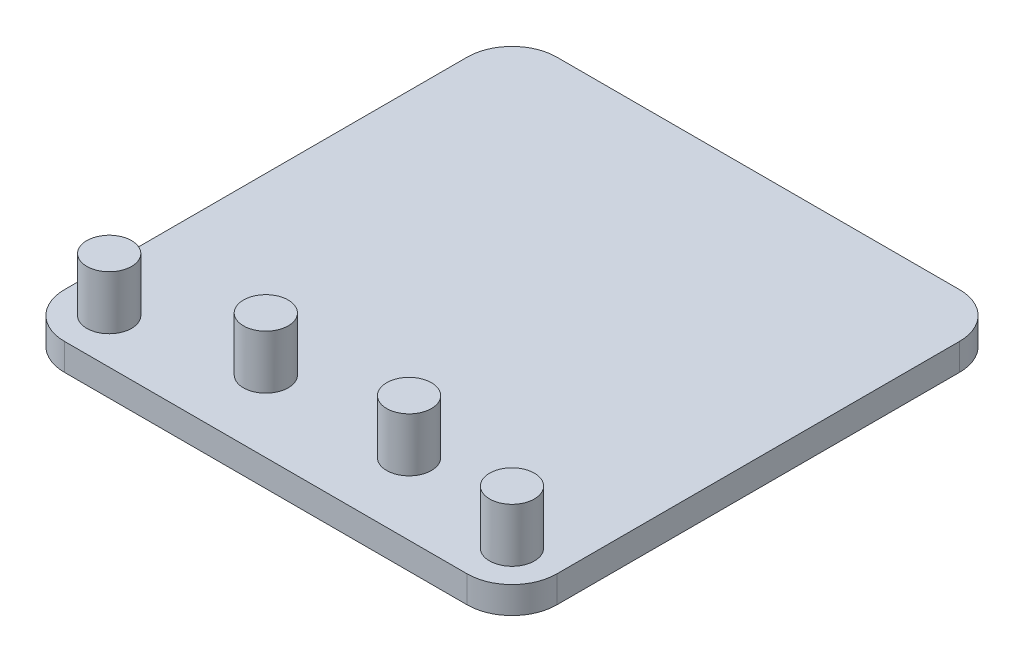
ISO-10303-21;
HEADER;
FILE_DESCRIPTION(('STEP AP214'),'2;1');
FILE_NAME('part.step','',(''),(''),'','','');
FILE_SCHEMA(('AUTOMOTIVE_DESIGN { 1 0 10303 214 1 1 1 1 }'));
ENDSEC;
DATA;
#1=APPLICATION_CONTEXT('core data for automotive mechanical design processes');
#2=APPLICATION_PROTOCOL_DEFINITION('international standard','automotive_design',2000,#1);
#3=PRODUCT_CONTEXT('',#1,'mechanical');
#4=PRODUCT('Part','Part','',(#3));
#5=PRODUCT_RELATED_PRODUCT_CATEGORY('part','',(#4));
#6=PRODUCT_DEFINITION_FORMATION('','',#4);
#7=PRODUCT_DEFINITION_CONTEXT('part definition',#1,'design');
#8=PRODUCT_DEFINITION('design','',#6,#7);
#9=PRODUCT_DEFINITION_SHAPE('','',#8);
#10=(LENGTH_UNIT() NAMED_UNIT(*) SI_UNIT(.MILLI.,.METRE.));
#11=(NAMED_UNIT(*) PLANE_ANGLE_UNIT() SI_UNIT($,.RADIAN.));
#12=(NAMED_UNIT(*) SI_UNIT($,.STERADIAN.) SOLID_ANGLE_UNIT());
#13=UNCERTAINTY_MEASURE_WITH_UNIT(LENGTH_MEASURE(1.E-05),#10,'distance_accuracy_value','');
#14=(GEOMETRIC_REPRESENTATION_CONTEXT(3) GLOBAL_UNCERTAINTY_ASSIGNED_CONTEXT((#13)) GLOBAL_UNIT_ASSIGNED_CONTEXT((#10,
#11,#12)) REPRESENTATION_CONTEXT('',''));
#15=CARTESIAN_POINT('',(0.,0.,0.));
#16=DIRECTION('',(0.,0.,1.));
#17=DIRECTION('',(1.,0.,0.));
#18=AXIS2_PLACEMENT_3D('',#15,#16,#17);
#19=CARTESIAN_POINT('',(0.,6.,0.));
#20=DIRECTION('',(1.,0.,0.));
#21=DIRECTION('',(0.,0.,-1.));
#22=AXIS2_PLACEMENT_3D('',#19,#20,#21);
#23=PLANE('',#22);
#24=DIRECTION('',(0.,0.,1.));
#25=VECTOR('',#24,1.);
#26=CARTESIAN_POINT('',(0.,6.,0.));
#27=LINE('',#26,#25);
#28=CARTESIAN_POINT('',(0.,6.,-100.));
#29=VERTEX_POINT('',#28);
#30=CARTESIAN_POINT('',(0.,6.,-10.));
#31=VERTEX_POINT('',#30);
#32=EDGE_CURVE('E123',#29,#31,#27,.T.);
#33=ORIENTED_EDGE('',*,*,#32,.F.);
#34=DIRECTION('',(0.,-1.,0.));
#35=VECTOR('',#34,1.);
#36=CARTESIAN_POINT('',(0.,6.,-100.));
#37=LINE('',#36,#35);
#38=CARTESIAN_POINT('',(0.,0.,-100.));
#39=VERTEX_POINT('',#38);
#40=EDGE_CURVE('E108',#29,#39,#37,.T.);
#41=ORIENTED_EDGE('',*,*,#40,.T.);
#42=DIRECTION('',(0.,0.,1.));
#43=VECTOR('',#42,1.);
#44=CARTESIAN_POINT('',(0.,0.,0.));
#45=LINE('',#44,#43);
#46=CARTESIAN_POINT('',(0.,0.,-10.));
#47=VERTEX_POINT('',#46);
#48=EDGE_CURVE('E120',#39,#47,#45,.T.);
#49=ORIENTED_EDGE('',*,*,#48,.T.);
#50=DIRECTION('',(0.,-1.,0.));
#51=VECTOR('',#50,1.);
#52=CARTESIAN_POINT('',(0.,6.,-10.));
#53=LINE('',#52,#51);
#54=EDGE_CURVE('E125',#47,#31,#53,.F.);
#55=ORIENTED_EDGE('',*,*,#54,.T.);
#56=EDGE_LOOP('',(#33,#41,#49,#55));
#57=FACE_BOUND('',#56,.T.);
#58=ADVANCED_FACE('F37',(#57),#23,.F.);
#59=CARTESIAN_POINT('',(0.,6.,0.));
#60=DIRECTION('',(0.,0.,-1.));
#61=DIRECTION('',(-1.,0.,0.));
#62=AXIS2_PLACEMENT_3D('',#59,#60,#61);
#63=PLANE('',#62);
#64=DIRECTION('',(1.,0.,0.));
#65=VECTOR('',#64,1.);
#66=CARTESIAN_POINT('',(0.,0.,0.));
#67=LINE('',#66,#65);
#68=CARTESIAN_POINT('',(10.,0.,0.));
#69=VERTEX_POINT('',#68);
#70=CARTESIAN_POINT('',(100.,0.,0.));
#71=VERTEX_POINT('',#70);
#72=EDGE_CURVE('E129',#69,#71,#67,.T.);
#73=ORIENTED_EDGE('',*,*,#72,.T.);
#74=DIRECTION('',(0.,-1.,0.));
#75=VECTOR('',#74,1.);
#76=CARTESIAN_POINT('',(100.,6.,0.));
#77=LINE('',#76,#75);
#78=CARTESIAN_POINT('',(100.,6.,0.));
#79=VERTEX_POINT('',#78);
#80=EDGE_CURVE('E167',#71,#79,#77,.F.);
#81=ORIENTED_EDGE('',*,*,#80,.T.);
#82=DIRECTION('',(1.,0.,0.));
#83=VECTOR('',#82,1.);
#84=CARTESIAN_POINT('',(0.,6.,0.));
#85=LINE('',#84,#83);
#86=CARTESIAN_POINT('',(10.,6.,0.));
#87=VERTEX_POINT('',#86);
#88=EDGE_CURVE('E194',#87,#79,#85,.T.);
#89=ORIENTED_EDGE('',*,*,#88,.F.);
#90=DIRECTION('',(0.,-1.,0.));
#91=VECTOR('',#90,1.);
#92=CARTESIAN_POINT('',(10.,6.,0.));
#93=LINE('',#92,#91);
#94=EDGE_CURVE('E164',#87,#69,#93,.T.);
#95=ORIENTED_EDGE('',*,*,#94,.T.);
#96=EDGE_LOOP('',(#73,#81,#89,#95));
#97=FACE_BOUND('',#96,.T.);
#98=ADVANCED_FACE('F223',(#97),#63,.F.);
#99=CARTESIAN_POINT('',(110.,6.,0.));
#100=DIRECTION('',(-1.,0.,0.));
#101=DIRECTION('',(0.,0.,1.));
#102=AXIS2_PLACEMENT_3D('',#99,#100,#101);
#103=PLANE('',#102);
#104=DIRECTION('',(0.,0.,-1.));
#105=VECTOR('',#104,1.);
#106=CARTESIAN_POINT('',(110.,0.,0.));
#107=LINE('',#106,#105);
#108=CARTESIAN_POINT('',(110.,0.,-10.));
#109=VERTEX_POINT('',#108);
#110=CARTESIAN_POINT('',(110.,0.,-100.));
#111=VERTEX_POINT('',#110);
#112=EDGE_CURVE('E133',#109,#111,#107,.T.);
#113=ORIENTED_EDGE('',*,*,#112,.T.);
#114=DIRECTION('',(0.,-1.,0.));
#115=VECTOR('',#114,1.);
#116=CARTESIAN_POINT('',(110.,6.,-100.));
#117=LINE('',#116,#115);
#118=CARTESIAN_POINT('',(110.,6.,-100.));
#119=VERTEX_POINT('',#118);
#120=EDGE_CURVE('E52',#111,#119,#117,.F.);
#121=ORIENTED_EDGE('',*,*,#120,.T.);
#122=DIRECTION('',(0.,0.,-1.));
#123=VECTOR('',#122,1.);
#124=CARTESIAN_POINT('',(110.,6.,0.));
#125=LINE('',#124,#123);
#126=CARTESIAN_POINT('',(110.,6.,-10.));
#127=VERTEX_POINT('',#126);
#128=EDGE_CURVE('E193',#127,#119,#125,.T.);
#129=ORIENTED_EDGE('',*,*,#128,.F.);
#130=DIRECTION('',(0.,-1.,0.));
#131=VECTOR('',#130,1.);
#132=CARTESIAN_POINT('',(110.,6.,-10.));
#133=LINE('',#132,#131);
#134=EDGE_CURVE('E160',#127,#109,#133,.T.);
#135=ORIENTED_EDGE('',*,*,#134,.T.);
#136=EDGE_LOOP('',(#113,#121,#129,#135));
#137=FACE_BOUND('',#136,.T.);
#138=ADVANCED_FACE('F228',(#137),#103,.F.);
#139=CARTESIAN_POINT('',(0.,6.,-110.));
#140=DIRECTION('',(0.,0.,1.));
#141=DIRECTION('',(1.,0.,0.));
#142=AXIS2_PLACEMENT_3D('',#139,#140,#141);
#143=PLANE('',#142);
#144=DIRECTION('',(-1.,0.,0.));
#145=VECTOR('',#144,1.);
#146=CARTESIAN_POINT('',(0.,0.,-110.));
#147=LINE('',#146,#145);
#148=CARTESIAN_POINT('',(100.,0.,-110.));
#149=VERTEX_POINT('',#148);
#150=CARTESIAN_POINT('',(10.,0.,-110.));
#151=VERTEX_POINT('',#150);
#152=EDGE_CURVE('E143',#149,#151,#147,.T.);
#153=ORIENTED_EDGE('',*,*,#152,.T.);
#154=DIRECTION('',(0.,-1.,0.));
#155=VECTOR('',#154,1.);
#156=CARTESIAN_POINT('',(10.,6.,-110.));
#157=LINE('',#156,#155);
#158=CARTESIAN_POINT('',(10.,6.,-110.));
#159=VERTEX_POINT('',#158);
#160=EDGE_CURVE('E109',#151,#159,#157,.F.);
#161=ORIENTED_EDGE('',*,*,#160,.T.);
#162=DIRECTION('',(-1.,0.,0.));
#163=VECTOR('',#162,1.);
#164=CARTESIAN_POINT('',(0.,6.,-110.));
#165=LINE('',#164,#163);
#166=CARTESIAN_POINT('',(100.,6.,-110.));
#167=VERTEX_POINT('',#166);
#168=EDGE_CURVE('E139',#167,#159,#165,.T.);
#169=ORIENTED_EDGE('',*,*,#168,.F.);
#170=DIRECTION('',(0.,-1.,0.));
#171=VECTOR('',#170,1.);
#172=CARTESIAN_POINT('',(100.,6.,-110.));
#173=LINE('',#172,#171);
#174=EDGE_CURVE('E114',#167,#149,#173,.T.);
#175=ORIENTED_EDGE('',*,*,#174,.T.);
#176=EDGE_LOOP('',(#153,#161,#169,#175));
#177=FACE_BOUND('',#176,.T.);
#178=ADVANCED_FACE('F182',(#177),#143,.F.);
#179=CARTESIAN_POINT('',(0.,6.,0.));
#180=DIRECTION('',(0.,-1.,0.));
#181=DIRECTION('',(0.,0.,-1.));
#182=AXIS2_PLACEMENT_3D('',#179,#180,#181);
#183=PLANE('',#182);
#184=CARTESIAN_POINT('',(100.,6.,-10.));
#185=DIRECTION('',(0.,-1.,0.));
#186=DIRECTION('',(0.,0.,-1.));
#187=AXIS2_PLACEMENT_3D('',#184,#185,#186);
#188=CIRCLE('',#187,5.);
#189=CARTESIAN_POINT('',(100.,6.,-15.));
#190=VERTEX_POINT('',#189);
#191=EDGE_CURVE('E11',#190,#190,#188,.F.);
#192=ORIENTED_EDGE('',*,*,#191,.F.);
#193=EDGE_LOOP('',(#192));
#194=FACE_BOUND('',#193,.T.);
#195=CARTESIAN_POINT('',(10.,6.,-9.99999999999999));
#196=DIRECTION('',(0.,-1.,0.));
#197=DIRECTION('',(0.,0.,-1.));
#198=AXIS2_PLACEMENT_3D('',#195,#196,#197);
#199=CIRCLE('',#198,5.);
#200=CARTESIAN_POINT('',(10.,6.,-15.));
#201=VERTEX_POINT('',#200);
#202=EDGE_CURVE('E45',#201,#201,#199,.F.);
#203=ORIENTED_EDGE('',*,*,#202,.F.);
#204=EDGE_LOOP('',(#203));
#205=FACE_BOUND('',#204,.T.);
#206=CARTESIAN_POINT('',(71.,6.,-16.));
#207=DIRECTION('',(0.,-1.,0.));
#208=DIRECTION('',(0.,0.,-1.));
#209=AXIS2_PLACEMENT_3D('',#206,#207,#208);
#210=CIRCLE('',#209,5.);
#211=CARTESIAN_POINT('',(71.,6.,-21.));
#212=VERTEX_POINT('',#211);
#213=EDGE_CURVE('E172',#212,#212,#210,.F.);
#214=ORIENTED_EDGE('',*,*,#213,.F.);
#215=EDGE_LOOP('',(#214));
#216=FACE_BOUND('',#215,.T.);
#217=CARTESIAN_POINT('',(39.,6.,-16.));
#218=DIRECTION('',(0.,-1.,0.));
#219=DIRECTION('',(0.,0.,-1.));
#220=AXIS2_PLACEMENT_3D('',#217,#218,#219);
#221=CIRCLE('',#220,5.);
#222=CARTESIAN_POINT('',(39.,6.,-21.));
#223=VERTEX_POINT('',#222);
#224=EDGE_CURVE('E169',#223,#223,#221,.F.);
#225=ORIENTED_EDGE('',*,*,#224,.F.);
#226=EDGE_LOOP('',(#225));
#227=FACE_BOUND('',#226,.T.);
#228=ORIENTED_EDGE('',*,*,#168,.T.);
#229=CARTESIAN_POINT('',(10.,6.,-100.));
#230=DIRECTION('',(0.,-1.,0.));
#231=DIRECTION('',(0.,0.,-1.));
#232=AXIS2_PLACEMENT_3D('',#229,#230,#231);
#233=CIRCLE('',#232,10.);
#234=EDGE_CURVE('E158',#159,#29,#233,.F.);
#235=ORIENTED_EDGE('',*,*,#234,.T.);
#236=ORIENTED_EDGE('',*,*,#32,.T.);
#237=CARTESIAN_POINT('',(10.,6.,-10.));
#238=DIRECTION('',(0.,-1.,0.));
#239=DIRECTION('',(0.,0.,-1.));
#240=AXIS2_PLACEMENT_3D('',#237,#238,#239);
#241=CIRCLE('',#240,10.);
#242=EDGE_CURVE('E153',#31,#87,#241,.F.);
#243=ORIENTED_EDGE('',*,*,#242,.T.);
#244=ORIENTED_EDGE('',*,*,#88,.T.);
#245=CARTESIAN_POINT('',(100.,6.,-10.));
#246=DIRECTION('',(0.,-1.,0.));
#247=DIRECTION('',(0.,0.,-1.));
#248=AXIS2_PLACEMENT_3D('',#245,#246,#247);
#249=CIRCLE('',#248,10.);
#250=EDGE_CURVE('E59',#79,#127,#249,.F.);
#251=ORIENTED_EDGE('',*,*,#250,.T.);
#252=ORIENTED_EDGE('',*,*,#128,.T.);
#253=CARTESIAN_POINT('',(100.,6.,-100.));
#254=DIRECTION('',(0.,-1.,0.));
#255=DIRECTION('',(0.,0.,-1.));
#256=AXIS2_PLACEMENT_3D('',#253,#254,#255);
#257=CIRCLE('',#256,10.);
#258=EDGE_CURVE('E156',#119,#167,#257,.F.);
#259=ORIENTED_EDGE('',*,*,#258,.T.);
#260=EDGE_LOOP('',(#228,#235,#236,#243,#244,#251,#252,#259));
#261=FACE_BOUND('',#260,.T.);
#262=ADVANCED_FACE('F179',(#194,#205,#216,#227,#261),#183,.F.);
#263=CARTESIAN_POINT('',(0.,0.,0.));
#264=DIRECTION('',(0.,-1.,0.));
#265=DIRECTION('',(0.,0.,-1.));
#266=AXIS2_PLACEMENT_3D('',#263,#264,#265);
#267=PLANE('',#266);
#268=ORIENTED_EDGE('',*,*,#48,.F.);
#269=CARTESIAN_POINT('',(10.,0.,-100.));
#270=DIRECTION('',(0.,-1.,0.));
#271=DIRECTION('',(0.,0.,-1.));
#272=AXIS2_PLACEMENT_3D('',#269,#270,#271);
#273=CIRCLE('',#272,10.);
#274=EDGE_CURVE('E104',#39,#151,#273,.T.);
#275=ORIENTED_EDGE('',*,*,#274,.T.);
#276=ORIENTED_EDGE('',*,*,#152,.F.);
#277=CARTESIAN_POINT('',(100.,0.,-100.));
#278=DIRECTION('',(0.,-1.,0.));
#279=DIRECTION('',(0.,0.,-1.));
#280=AXIS2_PLACEMENT_3D('',#277,#278,#279);
#281=CIRCLE('',#280,10.);
#282=EDGE_CURVE('E115',#149,#111,#281,.T.);
#283=ORIENTED_EDGE('',*,*,#282,.T.);
#284=ORIENTED_EDGE('',*,*,#112,.F.);
#285=CARTESIAN_POINT('',(100.,0.,-10.));
#286=DIRECTION('',(0.,-1.,0.));
#287=DIRECTION('',(0.,0.,-1.));
#288=AXIS2_PLACEMENT_3D('',#285,#286,#287);
#289=CIRCLE('',#288,10.);
#290=EDGE_CURVE('E147',#109,#71,#289,.T.);
#291=ORIENTED_EDGE('',*,*,#290,.T.);
#292=ORIENTED_EDGE('',*,*,#72,.F.);
#293=CARTESIAN_POINT('',(10.,0.,-10.));
#294=DIRECTION('',(0.,-1.,0.));
#295=DIRECTION('',(0.,0.,-1.));
#296=AXIS2_PLACEMENT_3D('',#293,#294,#295);
#297=CIRCLE('',#296,10.);
#298=EDGE_CURVE('E124',#69,#47,#297,.T.);
#299=ORIENTED_EDGE('',*,*,#298,.T.);
#300=EDGE_LOOP('',(#268,#275,#276,#283,#284,#291,#292,#299));
#301=FACE_BOUND('',#300,.T.);
#302=ADVANCED_FACE('F127',(#301),#267,.T.);
#303=CARTESIAN_POINT('',(10.,6.,-100.));
#304=DIRECTION('',(0.,-1.,0.));
#305=DIRECTION('',(0.,0.,-1.));
#306=AXIS2_PLACEMENT_3D('',#303,#304,#305);
#307=CYLINDRICAL_SURFACE('',#306,10.);
#308=ORIENTED_EDGE('',*,*,#234,.F.);
#309=ORIENTED_EDGE('',*,*,#160,.F.);
#310=ORIENTED_EDGE('',*,*,#274,.F.);
#311=ORIENTED_EDGE('',*,*,#40,.F.);
#312=EDGE_LOOP('',(#308,#309,#310,#311));
#313=FACE_BOUND('',#312,.T.);
#314=ADVANCED_FACE('F107',(#313),#307,.T.);
#315=CARTESIAN_POINT('',(100.,6.,-100.));
#316=DIRECTION('',(0.,-1.,0.));
#317=DIRECTION('',(0.,0.,-1.));
#318=AXIS2_PLACEMENT_3D('',#315,#316,#317);
#319=CYLINDRICAL_SURFACE('',#318,10.);
#320=ORIENTED_EDGE('',*,*,#258,.F.);
#321=ORIENTED_EDGE('',*,*,#120,.F.);
#322=ORIENTED_EDGE('',*,*,#282,.F.);
#323=ORIENTED_EDGE('',*,*,#174,.F.);
#324=EDGE_LOOP('',(#320,#321,#322,#323));
#325=FACE_BOUND('',#324,.T.);
#326=ADVANCED_FACE('F235',(#325),#319,.T.);
#327=CARTESIAN_POINT('',(100.,6.,-10.));
#328=DIRECTION('',(0.,-1.,0.));
#329=DIRECTION('',(0.,0.,-1.));
#330=AXIS2_PLACEMENT_3D('',#327,#328,#329);
#331=CYLINDRICAL_SURFACE('',#330,10.);
#332=ORIENTED_EDGE('',*,*,#250,.F.);
#333=ORIENTED_EDGE('',*,*,#80,.F.);
#334=ORIENTED_EDGE('',*,*,#290,.F.);
#335=ORIENTED_EDGE('',*,*,#134,.F.);
#336=EDGE_LOOP('',(#332,#333,#334,#335));
#337=FACE_BOUND('',#336,.T.);
#338=ADVANCED_FACE('F237',(#337),#331,.T.);
#339=CARTESIAN_POINT('',(10.,6.,-10.));
#340=DIRECTION('',(0.,-1.,0.));
#341=DIRECTION('',(0.,0.,-1.));
#342=AXIS2_PLACEMENT_3D('',#339,#340,#341);
#343=CYLINDRICAL_SURFACE('',#342,10.);
#344=ORIENTED_EDGE('',*,*,#242,.F.);
#345=ORIENTED_EDGE('',*,*,#54,.F.);
#346=ORIENTED_EDGE('',*,*,#298,.F.);
#347=ORIENTED_EDGE('',*,*,#94,.F.);
#348=EDGE_LOOP('',(#344,#345,#346,#347));
#349=FACE_BOUND('',#348,.T.);
#350=ADVANCED_FACE('F39',(#349),#343,.T.);
#351=CARTESIAN_POINT('',(39.,18.,-16.));
#352=DIRECTION('',(0.,-1.,0.));
#353=DIRECTION('',(0.,0.,-1.));
#354=AXIS2_PLACEMENT_3D('',#351,#352,#353);
#355=CYLINDRICAL_SURFACE('',#354,5.);
#356=CARTESIAN_POINT('',(39.,18.,-16.));
#357=DIRECTION('',(0.,1.,0.));
#358=DIRECTION('',(0.,0.,1.));
#359=AXIS2_PLACEMENT_3D('',#356,#357,#358);
#360=CIRCLE('',#359,5.);
#361=CARTESIAN_POINT('',(39.,18.,-11.));
#362=VERTEX_POINT('',#361);
#363=EDGE_CURVE('E130',#362,#362,#360,.T.);
#364=ORIENTED_EDGE('',*,*,#363,.F.);
#365=EDGE_LOOP('',(#364));
#366=FACE_BOUND('',#365,.T.);
#367=ORIENTED_EDGE('',*,*,#224,.T.);
#368=EDGE_LOOP('',(#367));
#369=FACE_BOUND('',#368,.T.);
#370=ADVANCED_FACE('F244',(#366,#369),#355,.T.);
#371=CARTESIAN_POINT('',(39.,18.,-16.));
#372=DIRECTION('',(0.,1.,0.));
#373=DIRECTION('',(0.,0.,1.));
#374=AXIS2_PLACEMENT_3D('',#371,#372,#373);
#375=PLANE('',#374);
#376=ORIENTED_EDGE('',*,*,#363,.T.);
#377=EDGE_LOOP('',(#376));
#378=FACE_BOUND('',#377,.T.);
#379=ADVANCED_FACE('F259',(#378),#375,.T.);
#380=CARTESIAN_POINT('',(71.,18.,-16.));
#381=DIRECTION('',(0.,-1.,0.));
#382=DIRECTION('',(0.,0.,-1.));
#383=AXIS2_PLACEMENT_3D('',#380,#381,#382);
#384=CYLINDRICAL_SURFACE('',#383,5.);
#385=CARTESIAN_POINT('',(71.,18.,-16.));
#386=DIRECTION('',(0.,1.,0.));
#387=DIRECTION('',(0.,0.,1.));
#388=AXIS2_PLACEMENT_3D('',#385,#386,#387);
#389=CIRCLE('',#388,5.);
#390=CARTESIAN_POINT('',(71.,18.,-11.));
#391=VERTEX_POINT('',#390);
#392=EDGE_CURVE('E136',#391,#391,#389,.T.);
#393=ORIENTED_EDGE('',*,*,#392,.F.);
#394=EDGE_LOOP('',(#393));
#395=FACE_BOUND('',#394,.T.);
#396=ORIENTED_EDGE('',*,*,#213,.T.);
#397=EDGE_LOOP('',(#396));
#398=FACE_BOUND('',#397,.T.);
#399=ADVANCED_FACE('F263',(#395,#398),#384,.T.);
#400=CARTESIAN_POINT('',(71.,18.,-16.));
#401=DIRECTION('',(0.,1.,0.));
#402=DIRECTION('',(0.,0.,1.));
#403=AXIS2_PLACEMENT_3D('',#400,#401,#402);
#404=PLANE('',#403);
#405=ORIENTED_EDGE('',*,*,#392,.T.);
#406=EDGE_LOOP('',(#405));
#407=FACE_BOUND('',#406,.T.);
#408=ADVANCED_FACE('F267',(#407),#404,.T.);
#409=CARTESIAN_POINT('',(10.,18.,-9.99999999999999));
#410=DIRECTION('',(0.,-1.,0.));
#411=DIRECTION('',(0.,0.,-1.));
#412=AXIS2_PLACEMENT_3D('',#409,#410,#411);
#413=CYLINDRICAL_SURFACE('',#412,5.);
#414=CARTESIAN_POINT('',(10.,18.,-9.99999999999999));
#415=DIRECTION('',(0.,1.,0.));
#416=DIRECTION('',(0.,0.,1.));
#417=AXIS2_PLACEMENT_3D('',#414,#415,#416);
#418=CIRCLE('',#417,5.);
#419=CARTESIAN_POINT('',(10.,18.,-4.99999999999999));
#420=VERTEX_POINT('',#419);
#421=EDGE_CURVE('E200',#420,#420,#418,.T.);
#422=ORIENTED_EDGE('',*,*,#421,.F.);
#423=EDGE_LOOP('',(#422));
#424=FACE_BOUND('',#423,.T.);
#425=ORIENTED_EDGE('',*,*,#202,.T.);
#426=EDGE_LOOP('',(#425));
#427=FACE_BOUND('',#426,.T.);
#428=ADVANCED_FACE('F177',(#424,#427),#413,.T.);
#429=CARTESIAN_POINT('',(10.,18.,-9.99999999999999));
#430=DIRECTION('',(0.,1.,0.));
#431=DIRECTION('',(0.,0.,1.));
#432=AXIS2_PLACEMENT_3D('',#429,#430,#431);
#433=PLANE('',#432);
#434=ORIENTED_EDGE('',*,*,#421,.T.);
#435=EDGE_LOOP('',(#434));
#436=FACE_BOUND('',#435,.T.);
#437=ADVANCED_FACE('F212',(#436),#433,.T.);
#438=CARTESIAN_POINT('',(100.,18.,-10.));
#439=DIRECTION('',(0.,-1.,0.));
#440=DIRECTION('',(0.,0.,-1.));
#441=AXIS2_PLACEMENT_3D('',#438,#439,#440);
#442=CYLINDRICAL_SURFACE('',#441,5.);
#443=CARTESIAN_POINT('',(100.,18.,-10.));
#444=DIRECTION('',(0.,1.,0.));
#445=DIRECTION('',(0.,0.,1.));
#446=AXIS2_PLACEMENT_3D('',#443,#444,#445);
#447=CIRCLE('',#446,5.);
#448=CARTESIAN_POINT('',(100.,18.,-5.));
#449=VERTEX_POINT('',#448);
#450=EDGE_CURVE('E203',#449,#449,#447,.T.);
#451=ORIENTED_EDGE('',*,*,#450,.F.);
#452=EDGE_LOOP('',(#451));
#453=FACE_BOUND('',#452,.T.);
#454=ORIENTED_EDGE('',*,*,#191,.T.);
#455=EDGE_LOOP('',(#454));
#456=FACE_BOUND('',#455,.T.);
#457=ADVANCED_FACE('F209',(#453,#456),#442,.T.);
#458=CARTESIAN_POINT('',(100.,18.,-10.));
#459=DIRECTION('',(0.,1.,0.));
#460=DIRECTION('',(0.,0.,1.));
#461=AXIS2_PLACEMENT_3D('',#458,#459,#460);
#462=PLANE('',#461);
#463=ORIENTED_EDGE('',*,*,#450,.T.);
#464=EDGE_LOOP('',(#463));
#465=FACE_BOUND('',#464,.T.);
#466=ADVANCED_FACE('F207',(#465),#462,.T.);
#467=CLOSED_SHELL('',(#58,#98,#138,#178,#262,#302,#314,#326,#338,#350,#370,#379,#399,#408,#428,
#437,#457,#466));
#468=MANIFOLD_SOLID_BREP('B2',#467);
#469=ADVANCED_BREP_SHAPE_REPRESENTATION('',(#18,#468),#14);
#470=SHAPE_DEFINITION_REPRESENTATION(#9,#469);
ENDSEC;
END-ISO-10303-21;
